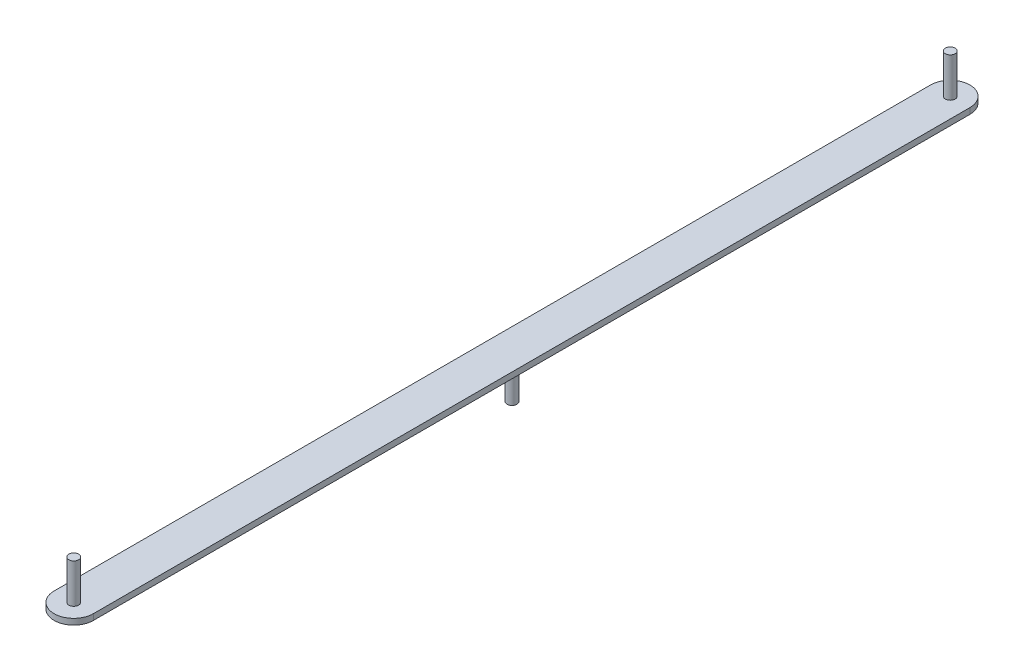
ISO-10303-21;
HEADER;
FILE_DESCRIPTION(('STEP AP214'),'2;1');
FILE_NAME('part.step','',(''),(''),'','','');
FILE_SCHEMA(('AUTOMOTIVE_DESIGN { 1 0 10303 214 1 1 1 1 }'));
ENDSEC;
DATA;
#1=APPLICATION_CONTEXT('core data for automotive mechanical design processes');
#2=APPLICATION_PROTOCOL_DEFINITION('international standard','automotive_design',2000,#1);
#3=PRODUCT_CONTEXT('',#1,'mechanical');
#4=PRODUCT('Part','Part','',(#3));
#5=PRODUCT_RELATED_PRODUCT_CATEGORY('part','',(#4));
#6=PRODUCT_DEFINITION_FORMATION('','',#4);
#7=PRODUCT_DEFINITION_CONTEXT('part definition',#1,'design');
#8=PRODUCT_DEFINITION('design','',#6,#7);
#9=PRODUCT_DEFINITION_SHAPE('','',#8);
#10=(LENGTH_UNIT() NAMED_UNIT(*) SI_UNIT(.MILLI.,.METRE.));
#11=(NAMED_UNIT(*) PLANE_ANGLE_UNIT() SI_UNIT($,.RADIAN.));
#12=(NAMED_UNIT(*) SI_UNIT($,.STERADIAN.) SOLID_ANGLE_UNIT());
#13=UNCERTAINTY_MEASURE_WITH_UNIT(LENGTH_MEASURE(1.E-05),#10,'distance_accuracy_value','');
#14=(GEOMETRIC_REPRESENTATION_CONTEXT(3) GLOBAL_UNCERTAINTY_ASSIGNED_CONTEXT((#13)) GLOBAL_UNIT_ASSIGNED_CONTEXT((#10,
#11,#12)) REPRESENTATION_CONTEXT('',''));
#15=CARTESIAN_POINT('',(0.,0.,0.));
#16=DIRECTION('',(0.,0.,1.));
#17=DIRECTION('',(1.,0.,0.));
#18=AXIS2_PLACEMENT_3D('',#15,#16,#17);
#19=CARTESIAN_POINT('',(-15.7692307692308,3.,-365.615384615385));
#20=DIRECTION('',(0.,-1.,0.));
#21=DIRECTION('',(0.,0.,-1.));
#22=AXIS2_PLACEMENT_3D('',#19,#20,#21);
#23=CYLINDRICAL_SURFACE('',#22,10.);
#24=CARTESIAN_POINT('',(-15.7692307692308,0.,-365.615384615385));
#25=DIRECTION('',(0.,1.,0.));
#26=DIRECTION('',(0.,0.,-1.));
#27=AXIS2_PLACEMENT_3D('',#24,#25,#26);
#28=CIRCLE('',#27,10.);
#29=CARTESIAN_POINT('',(-5.76923076923083,0.,-365.615384615385));
#30=VERTEX_POINT('',#29);
#31=CARTESIAN_POINT('',(-25.7692307692308,0.,-365.615384615385));
#32=VERTEX_POINT('',#31);
#33=EDGE_CURVE('E122',#30,#32,#28,.T.);
#34=ORIENTED_EDGE('',*,*,#33,.T.);
#35=DIRECTION('',(0.,-1.,0.));
#36=VECTOR('',#35,1.);
#37=CARTESIAN_POINT('',(-25.7692307692308,3.,-365.615384615385));
#38=LINE('',#37,#36);
#39=CARTESIAN_POINT('',(-25.7692307692308,3.,-365.615384615385));
#40=VERTEX_POINT('',#39);
#41=EDGE_CURVE('E111',#40,#32,#38,.T.);
#42=ORIENTED_EDGE('',*,*,#41,.F.);
#43=CARTESIAN_POINT('',(-15.7692307692308,3.,-365.615384615385));
#44=DIRECTION('',(0.,1.,0.));
#45=DIRECTION('',(0.,0.,-1.));
#46=AXIS2_PLACEMENT_3D('',#43,#44,#45);
#47=CIRCLE('',#46,10.);
#48=CARTESIAN_POINT('',(-5.76923076923083,3.,-365.615384615385));
#49=VERTEX_POINT('',#48);
#50=EDGE_CURVE('E103',#49,#40,#47,.T.);
#51=ORIENTED_EDGE('',*,*,#50,.F.);
#52=DIRECTION('',(0.,-1.,0.));
#53=VECTOR('',#52,1.);
#54=CARTESIAN_POINT('',(-5.76923076923083,3.,-365.615384615385));
#55=LINE('',#54,#53);
#56=EDGE_CURVE('E118',#49,#30,#55,.T.);
#57=ORIENTED_EDGE('',*,*,#56,.T.);
#58=EDGE_LOOP('',(#34,#42,#51,#57));
#59=FACE_BOUND('',#58,.T.);
#60=ADVANCED_FACE('F49',(#59),#23,.T.);
#61=CARTESIAN_POINT('',(-25.7692307692308,3.,-365.615384615385));
#62=DIRECTION('',(1.,0.,0.));
#63=DIRECTION('',(0.,0.,-1.));
#64=AXIS2_PLACEMENT_3D('',#61,#62,#63);
#65=PLANE('',#64);
#66=DIRECTION('',(0.,0.,1.));
#67=VECTOR('',#66,1.);
#68=CARTESIAN_POINT('',(-25.7692307692308,0.,-365.615384615385));
#69=LINE('',#68,#67);
#70=CARTESIAN_POINT('',(-25.7692307692308,0.,80.3846153846154));
#71=VERTEX_POINT('',#70);
#72=EDGE_CURVE('E109',#32,#71,#69,.T.);
#73=ORIENTED_EDGE('',*,*,#72,.T.);
#74=DIRECTION('',(0.,-1.,0.));
#75=VECTOR('',#74,1.);
#76=CARTESIAN_POINT('',(-25.7692307692308,3.,80.3846153846154));
#77=LINE('',#76,#75);
#78=CARTESIAN_POINT('',(-25.7692307692308,3.,80.3846153846154));
#79=VERTEX_POINT('',#78);
#80=EDGE_CURVE('E107',#79,#71,#77,.T.);
#81=ORIENTED_EDGE('',*,*,#80,.F.);
#82=DIRECTION('',(0.,0.,1.));
#83=VECTOR('',#82,1.);
#84=CARTESIAN_POINT('',(-25.7692307692308,3.,-365.615384615385));
#85=LINE('',#84,#83);
#86=EDGE_CURVE('E98',#40,#79,#85,.T.);
#87=ORIENTED_EDGE('',*,*,#86,.F.);
#88=ORIENTED_EDGE('',*,*,#41,.T.);
#89=EDGE_LOOP('',(#73,#81,#87,#88));
#90=FACE_BOUND('',#89,.T.);
#91=ADVANCED_FACE('F108',(#90),#65,.F.);
#92=CARTESIAN_POINT('',(-15.7692307692308,3.,80.3846153846154));
#93=DIRECTION('',(0.,-1.,0.));
#94=DIRECTION('',(0.,0.,-1.));
#95=AXIS2_PLACEMENT_3D('',#92,#93,#94);
#96=CYLINDRICAL_SURFACE('',#95,10.);
#97=CARTESIAN_POINT('',(-15.7692307692308,0.,80.3846153846154));
#98=DIRECTION('',(0.,1.,0.));
#99=DIRECTION('',(0.,0.,1.));
#100=AXIS2_PLACEMENT_3D('',#97,#98,#99);
#101=CIRCLE('',#100,10.);
#102=CARTESIAN_POINT('',(-5.76923076923078,0.,80.3846153846154));
#103=VERTEX_POINT('',#102);
#104=EDGE_CURVE('E84',#71,#103,#101,.T.);
#105=ORIENTED_EDGE('',*,*,#104,.T.);
#106=DIRECTION('',(0.,-1.,0.));
#107=VECTOR('',#106,1.);
#108=CARTESIAN_POINT('',(-5.76923076923078,3.,80.3846153846154));
#109=LINE('',#108,#107);
#110=CARTESIAN_POINT('',(-5.76923076923078,3.,80.3846153846154));
#111=VERTEX_POINT('',#110);
#112=EDGE_CURVE('E112',#111,#103,#109,.T.);
#113=ORIENTED_EDGE('',*,*,#112,.F.);
#114=CARTESIAN_POINT('',(-15.7692307692308,3.,80.3846153846154));
#115=DIRECTION('',(0.,1.,0.));
#116=DIRECTION('',(0.,0.,1.));
#117=AXIS2_PLACEMENT_3D('',#114,#115,#116);
#118=CIRCLE('',#117,10.);
#119=EDGE_CURVE('E101',#79,#111,#118,.T.);
#120=ORIENTED_EDGE('',*,*,#119,.F.);
#121=ORIENTED_EDGE('',*,*,#80,.T.);
#122=EDGE_LOOP('',(#105,#113,#120,#121));
#123=FACE_BOUND('',#122,.T.);
#124=ADVANCED_FACE('F114',(#123),#96,.T.);
#125=CARTESIAN_POINT('',(-5.76923076923083,3.,-365.615384615385));
#126=DIRECTION('',(-1.,0.,0.));
#127=DIRECTION('',(0.,0.,1.));
#128=AXIS2_PLACEMENT_3D('',#125,#126,#127);
#129=PLANE('',#128);
#130=DIRECTION('',(0.,0.,-1.));
#131=VECTOR('',#130,1.);
#132=CARTESIAN_POINT('',(-5.76923076923083,0.,-365.615384615385));
#133=LINE('',#132,#131);
#134=EDGE_CURVE('E90',#103,#30,#133,.T.);
#135=ORIENTED_EDGE('',*,*,#134,.T.);
#136=ORIENTED_EDGE('',*,*,#56,.F.);
#137=DIRECTION('',(0.,0.,-1.));
#138=VECTOR('',#137,1.);
#139=CARTESIAN_POINT('',(-5.76923076923083,3.,-365.615384615385));
#140=LINE('',#139,#138);
#141=EDGE_CURVE('E67',#111,#49,#140,.T.);
#142=ORIENTED_EDGE('',*,*,#141,.F.);
#143=ORIENTED_EDGE('',*,*,#112,.T.);
#144=EDGE_LOOP('',(#135,#136,#142,#143));
#145=FACE_BOUND('',#144,.T.);
#146=ADVANCED_FACE('F152',(#145),#129,.F.);
#147=CARTESIAN_POINT('',(-15.7692307692308,3.,-365.615384615385));
#148=DIRECTION('',(0.,-1.,0.));
#149=DIRECTION('',(0.,0.,-1.));
#150=AXIS2_PLACEMENT_3D('',#147,#148,#149);
#151=PLANE('',#150);
#152=CARTESIAN_POINT('',(-15.7692307692308,3.,80.3846153846154));
#153=DIRECTION('',(0.,-1.,0.));
#154=DIRECTION('',(0.,0.,-1.));
#155=AXIS2_PLACEMENT_3D('',#152,#153,#154);
#156=CIRCLE('',#155,2.5);
#157=CARTESIAN_POINT('',(-15.7692307692308,3.,77.8846153846154));
#158=VERTEX_POINT('',#157);
#159=EDGE_CURVE('E52',#158,#158,#156,.F.);
#160=ORIENTED_EDGE('',*,*,#159,.F.);
#161=EDGE_LOOP('',(#160));
#162=FACE_BOUND('',#161,.T.);
#163=CARTESIAN_POINT('',(-15.7692307692308,3.,-365.615384615385));
#164=DIRECTION('',(0.,-1.,0.));
#165=DIRECTION('',(0.,0.,-1.));
#166=AXIS2_PLACEMENT_3D('',#163,#164,#165);
#167=CIRCLE('',#166,2.5);
#168=CARTESIAN_POINT('',(-15.7692307692308,3.,-368.115384615385));
#169=VERTEX_POINT('',#168);
#170=EDGE_CURVE('E138',#169,#169,#167,.F.);
#171=ORIENTED_EDGE('',*,*,#170,.F.);
#172=EDGE_LOOP('',(#171));
#173=FACE_BOUND('',#172,.T.);
#174=ORIENTED_EDGE('',*,*,#50,.T.);
#175=ORIENTED_EDGE('',*,*,#86,.T.);
#176=ORIENTED_EDGE('',*,*,#119,.T.);
#177=ORIENTED_EDGE('',*,*,#141,.T.);
#178=EDGE_LOOP('',(#174,#175,#176,#177));
#179=FACE_BOUND('',#178,.T.);
#180=ADVANCED_FACE('F99',(#162,#173,#179),#151,.F.);
#181=CARTESIAN_POINT('',(-15.7692307692308,0.,-365.615384615385));
#182=DIRECTION('',(0.,-1.,0.));
#183=DIRECTION('',(0.,0.,-1.));
#184=AXIS2_PLACEMENT_3D('',#181,#182,#183);
#185=PLANE('',#184);
#186=CARTESIAN_POINT('',(-15.7692307692308,0.,-142.615384615385));
#187=DIRECTION('',(0.,-1.,0.));
#188=DIRECTION('',(0.,0.,-1.));
#189=AXIS2_PLACEMENT_3D('',#186,#187,#188);
#190=CIRCLE('',#189,5.);
#191=CARTESIAN_POINT('',(-15.7692307692308,0.,-147.615384615385));
#192=VERTEX_POINT('',#191);
#193=EDGE_CURVE('E180',#192,#192,#190,.T.);
#194=ORIENTED_EDGE('',*,*,#193,.F.);
#195=EDGE_LOOP('',(#194));
#196=FACE_BOUND('',#195,.T.);
#197=ORIENTED_EDGE('',*,*,#33,.F.);
#198=ORIENTED_EDGE('',*,*,#134,.F.);
#199=ORIENTED_EDGE('',*,*,#104,.F.);
#200=ORIENTED_EDGE('',*,*,#72,.F.);
#201=EDGE_LOOP('',(#197,#198,#199,#200));
#202=FACE_BOUND('',#201,.T.);
#203=ADVANCED_FACE('F151',(#196,#202),#185,.T.);
#204=CARTESIAN_POINT('',(-15.7692307692308,23.,-365.615384615385));
#205=DIRECTION('',(0.,-1.,0.));
#206=DIRECTION('',(0.,0.,-1.));
#207=AXIS2_PLACEMENT_3D('',#204,#205,#206);
#208=CYLINDRICAL_SURFACE('',#207,2.5);
#209=CARTESIAN_POINT('',(-15.7692307692308,23.,-365.615384615385));
#210=DIRECTION('',(0.,1.,0.));
#211=DIRECTION('',(0.,0.,1.));
#212=AXIS2_PLACEMENT_3D('',#209,#210,#211);
#213=CIRCLE('',#212,2.5);
#214=CARTESIAN_POINT('',(-15.7692307692308,23.,-363.115384615385));
#215=VERTEX_POINT('',#214);
#216=EDGE_CURVE('E172',#215,#215,#213,.T.);
#217=ORIENTED_EDGE('',*,*,#216,.F.);
#218=EDGE_LOOP('',(#217));
#219=FACE_BOUND('',#218,.T.);
#220=ORIENTED_EDGE('',*,*,#170,.T.);
#221=EDGE_LOOP('',(#220));
#222=FACE_BOUND('',#221,.T.);
#223=ADVANCED_FACE('F158',(#219,#222),#208,.T.);
#224=CARTESIAN_POINT('',(-15.7692307692308,23.,-365.615384615385));
#225=DIRECTION('',(0.,1.,0.));
#226=DIRECTION('',(0.,0.,1.));
#227=AXIS2_PLACEMENT_3D('',#224,#225,#226);
#228=PLANE('',#227);
#229=ORIENTED_EDGE('',*,*,#216,.T.);
#230=EDGE_LOOP('',(#229));
#231=FACE_BOUND('',#230,.T.);
#232=ADVANCED_FACE('F220',(#231),#228,.T.);
#233=CARTESIAN_POINT('',(-15.7692307692308,23.,80.3846153846154));
#234=DIRECTION('',(0.,-1.,0.));
#235=DIRECTION('',(0.,0.,-1.));
#236=AXIS2_PLACEMENT_3D('',#233,#234,#235);
#237=CYLINDRICAL_SURFACE('',#236,2.5);
#238=CARTESIAN_POINT('',(-15.7692307692308,23.,80.3846153846154));
#239=DIRECTION('',(0.,1.,0.));
#240=DIRECTION('',(0.,0.,1.));
#241=AXIS2_PLACEMENT_3D('',#238,#239,#240);
#242=CIRCLE('',#241,2.5);
#243=CARTESIAN_POINT('',(-15.7692307692308,23.,82.8846153846154));
#244=VERTEX_POINT('',#243);
#245=EDGE_CURVE('E126',#244,#244,#242,.T.);
#246=ORIENTED_EDGE('',*,*,#245,.F.);
#247=EDGE_LOOP('',(#246));
#248=FACE_BOUND('',#247,.T.);
#249=ORIENTED_EDGE('',*,*,#159,.T.);
#250=EDGE_LOOP('',(#249));
#251=FACE_BOUND('',#250,.T.);
#252=ADVANCED_FACE('F147',(#248,#251),#237,.T.);
#253=CARTESIAN_POINT('',(-15.7692307692308,23.,80.3846153846154));
#254=DIRECTION('',(0.,1.,0.));
#255=DIRECTION('',(0.,0.,1.));
#256=AXIS2_PLACEMENT_3D('',#253,#254,#255);
#257=PLANE('',#256);
#258=ORIENTED_EDGE('',*,*,#245,.T.);
#259=EDGE_LOOP('',(#258));
#260=FACE_BOUND('',#259,.T.);
#261=ADVANCED_FACE('F209',(#260),#257,.T.);
#262=CARTESIAN_POINT('',(-15.7692307692308,-2.,-142.615384615385));
#263=DIRECTION('',(0.,1.,0.));
#264=DIRECTION('',(0.,0.,1.));
#265=AXIS2_PLACEMENT_3D('',#262,#263,#264);
#266=CYLINDRICAL_SURFACE('',#265,5.);
#267=CARTESIAN_POINT('',(-15.7692307692308,-2.,-142.615384615385));
#268=DIRECTION('',(0.,-1.,0.));
#269=DIRECTION('',(0.,0.,-1.));
#270=AXIS2_PLACEMENT_3D('',#267,#268,#269);
#271=CIRCLE('',#270,5.);
#272=CARTESIAN_POINT('',(-15.7692307692308,-2.,-147.615384615385));
#273=VERTEX_POINT('',#272);
#274=EDGE_CURVE('E176',#273,#273,#271,.T.);
#275=ORIENTED_EDGE('',*,*,#274,.F.);
#276=EDGE_LOOP('',(#275));
#277=FACE_BOUND('',#276,.T.);
#278=ORIENTED_EDGE('',*,*,#193,.T.);
#279=EDGE_LOOP('',(#278));
#280=FACE_BOUND('',#279,.T.);
#281=ADVANCED_FACE('F203',(#277,#280),#266,.T.);
#282=CARTESIAN_POINT('',(-15.7692307692308,-2.,-142.615384615385));
#283=DIRECTION('',(0.,-1.,0.));
#284=DIRECTION('',(0.,0.,-1.));
#285=AXIS2_PLACEMENT_3D('',#282,#283,#284);
#286=PLANE('',#285);
#287=CARTESIAN_POINT('',(-15.7692307692308,-2.,-142.615384615385));
#288=DIRECTION('',(0.,-1.,0.));
#289=DIRECTION('',(0.,0.,-1.));
#290=AXIS2_PLACEMENT_3D('',#287,#288,#289);
#291=CIRCLE('',#290,2.5);
#292=CARTESIAN_POINT('',(-15.7692307692308,-2.,-145.115384615385));
#293=VERTEX_POINT('',#292);
#294=EDGE_CURVE('E11',#293,#293,#291,.T.);
#295=ORIENTED_EDGE('',*,*,#294,.F.);
#296=EDGE_LOOP('',(#295));
#297=FACE_BOUND('',#296,.T.);
#298=ORIENTED_EDGE('',*,*,#274,.T.);
#299=EDGE_LOOP('',(#298));
#300=FACE_BOUND('',#299,.T.);
#301=ADVANCED_FACE('F197',(#297,#300),#286,.T.);
#302=CARTESIAN_POINT('',(-15.7692307692308,-20.,-142.615384615385));
#303=DIRECTION('',(0.,1.,0.));
#304=DIRECTION('',(0.,0.,1.));
#305=AXIS2_PLACEMENT_3D('',#302,#303,#304);
#306=CYLINDRICAL_SURFACE('',#305,2.5);
#307=CARTESIAN_POINT('',(-15.7692307692308,-20.,-142.615384615385));
#308=DIRECTION('',(0.,-1.,0.));
#309=DIRECTION('',(0.,0.,-1.));
#310=AXIS2_PLACEMENT_3D('',#307,#308,#309);
#311=CIRCLE('',#310,2.5);
#312=CARTESIAN_POINT('',(-15.7692307692308,-20.,-145.115384615385));
#313=VERTEX_POINT('',#312);
#314=EDGE_CURVE('E184',#313,#313,#311,.T.);
#315=ORIENTED_EDGE('',*,*,#314,.F.);
#316=EDGE_LOOP('',(#315));
#317=FACE_BOUND('',#316,.T.);
#318=ORIENTED_EDGE('',*,*,#294,.T.);
#319=EDGE_LOOP('',(#318));
#320=FACE_BOUND('',#319,.T.);
#321=ADVANCED_FACE('F194',(#317,#320),#306,.T.);
#322=CARTESIAN_POINT('',(-15.7692307692308,-20.,-142.615384615385));
#323=DIRECTION('',(0.,-1.,0.));
#324=DIRECTION('',(0.,0.,-1.));
#325=AXIS2_PLACEMENT_3D('',#322,#323,#324);
#326=PLANE('',#325);
#327=ORIENTED_EDGE('',*,*,#314,.T.);
#328=EDGE_LOOP('',(#327));
#329=FACE_BOUND('',#328,.T.);
#330=ADVANCED_FACE('F192',(#329),#326,.T.);
#331=CLOSED_SHELL('',(#60,#91,#124,#146,#180,#203,#223,#232,#252,#261,#281,#301,#321,#330));
#332=MANIFOLD_SOLID_BREP('B2',#331);
#333=ADVANCED_BREP_SHAPE_REPRESENTATION('',(#18,#332),#14);
#334=SHAPE_DEFINITION_REPRESENTATION(#9,#333);
ENDSEC;
END-ISO-10303-21;
